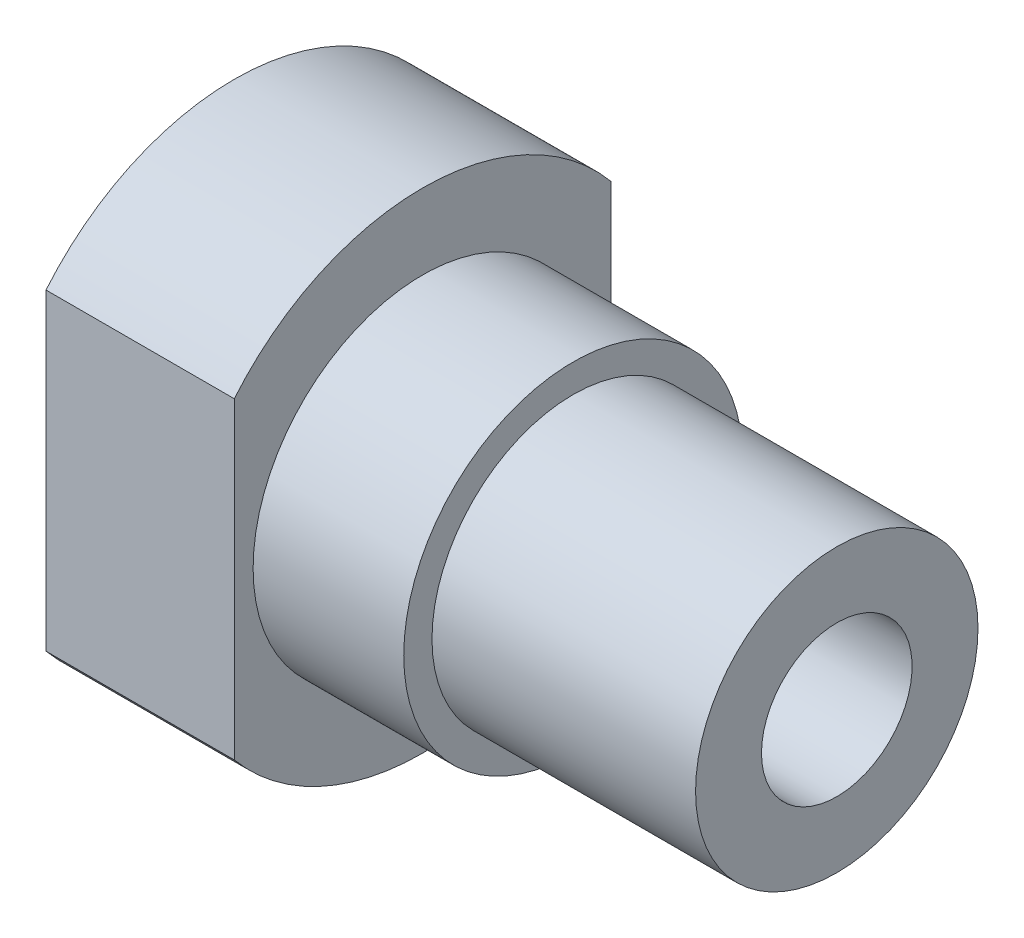
ISO-10303-21;
HEADER;
FILE_DESCRIPTION(('STEP AP214'),'2;1');
FILE_NAME('part.step','',(''),(''),'','','');
FILE_SCHEMA(('AUTOMOTIVE_DESIGN { 1 0 10303 214 1 1 1 1 }'));
ENDSEC;
DATA;
#1=APPLICATION_CONTEXT('core data for automotive mechanical design processes');
#2=APPLICATION_PROTOCOL_DEFINITION('international standard','automotive_design',2000,#1);
#3=PRODUCT_CONTEXT('',#1,'mechanical');
#4=PRODUCT('Part','Part','',(#3));
#5=PRODUCT_RELATED_PRODUCT_CATEGORY('part','',(#4));
#6=PRODUCT_DEFINITION_FORMATION('','',#4);
#7=PRODUCT_DEFINITION_CONTEXT('part definition',#1,'design');
#8=PRODUCT_DEFINITION('design','',#6,#7);
#9=PRODUCT_DEFINITION_SHAPE('','',#8);
#10=(LENGTH_UNIT() NAMED_UNIT(*) SI_UNIT(.MILLI.,.METRE.));
#11=(NAMED_UNIT(*) PLANE_ANGLE_UNIT() SI_UNIT($,.RADIAN.));
#12=(NAMED_UNIT(*) SI_UNIT($,.STERADIAN.) SOLID_ANGLE_UNIT());
#13=UNCERTAINTY_MEASURE_WITH_UNIT(LENGTH_MEASURE(1.E-05),#10,'distance_accuracy_value','');
#14=(GEOMETRIC_REPRESENTATION_CONTEXT(3) GLOBAL_UNCERTAINTY_ASSIGNED_CONTEXT((#13)) GLOBAL_UNIT_ASSIGNED_CONTEXT((#10,
#11,#12)) REPRESENTATION_CONTEXT('',''));
#15=CARTESIAN_POINT('',(0.,0.,0.));
#16=DIRECTION('',(0.,0.,1.));
#17=DIRECTION('',(1.,0.,0.));
#18=AXIS2_PLACEMENT_3D('',#15,#16,#17);
#19=CARTESIAN_POINT('',(0.,6.5,0.));
#20=DIRECTION('',(1.,0.,0.));
#21=DIRECTION('',(0.,0.,-1.));
#22=AXIS2_PLACEMENT_3D('',#19,#20,#21);
#23=PLANE('',#22);
#24=CARTESIAN_POINT('',(0.,0.,0.));
#25=DIRECTION('',(-1.,0.,0.));
#26=DIRECTION('',(0.,0.,1.));
#27=AXIS2_PLACEMENT_3D('',#24,#25,#26);
#28=CIRCLE('',#27,4.);
#29=CARTESIAN_POINT('',(0.,0.,4.));
#30=VERTEX_POINT('',#29);
#31=EDGE_CURVE('E11',#30,#30,#28,.T.);
#32=ORIENTED_EDGE('',*,*,#31,.F.);
#33=EDGE_LOOP('',(#32));
#34=FACE_BOUND('',#33,.T.);
#35=DIRECTION('',(0.,1.,0.));
#36=VECTOR('',#35,1.);
#37=CARTESIAN_POINT('',(0.,0.,-5.));
#38=LINE('',#37,#36);
#39=CARTESIAN_POINT('',(0.,-4.15331193145904,-5.));
#40=VERTEX_POINT('',#39);
#41=CARTESIAN_POINT('',(0.,4.15331193145904,-5.));
#42=VERTEX_POINT('',#41);
#43=EDGE_CURVE('E48',#40,#42,#38,.T.);
#44=ORIENTED_EDGE('',*,*,#43,.F.);
#45=CARTESIAN_POINT('',(0.,0.,0.));
#46=DIRECTION('',(-1.,0.,0.));
#47=DIRECTION('',(0.,0.,1.));
#48=AXIS2_PLACEMENT_3D('',#45,#46,#47);
#49=CIRCLE('',#48,6.5);
#50=CARTESIAN_POINT('',(0.,-4.15331193145904,5.));
#51=VERTEX_POINT('',#50);
#52=EDGE_CURVE('E85',#40,#51,#49,.T.);
#53=ORIENTED_EDGE('',*,*,#52,.T.);
#54=DIRECTION('',(0.,1.,0.));
#55=VECTOR('',#54,1.);
#56=CARTESIAN_POINT('',(0.,0.,5.));
#57=LINE('',#56,#55);
#58=CARTESIAN_POINT('',(0.,4.15331193145904,5.));
#59=VERTEX_POINT('',#58);
#60=EDGE_CURVE('E276',#51,#59,#57,.T.);
#61=ORIENTED_EDGE('',*,*,#60,.T.);
#62=EDGE_CURVE('E88',#59,#42,#49,.T.);
#63=ORIENTED_EDGE('',*,*,#62,.T.);
#64=EDGE_LOOP('',(#44,#53,#61,#63));
#65=FACE_BOUND('',#64,.T.);
#66=ADVANCED_FACE('F34',(#34,#65),#23,.F.);
#67=CARTESIAN_POINT('',(5.,4.5,0.));
#68=DIRECTION('',(-1.,0.,0.));
#69=DIRECTION('',(0.,0.,1.));
#70=AXIS2_PLACEMENT_3D('',#67,#68,#69);
#71=PLANE('',#70);
#72=CARTESIAN_POINT('',(5.,0.,0.));
#73=DIRECTION('',(-1.,0.,0.));
#74=DIRECTION('',(0.,0.,1.));
#75=AXIS2_PLACEMENT_3D('',#72,#73,#74);
#76=CIRCLE('',#75,4.5);
#77=CARTESIAN_POINT('',(5.,0.,4.5));
#78=VERTEX_POINT('',#77);
#79=EDGE_CURVE('E102',#78,#78,#76,.T.);
#80=ORIENTED_EDGE('',*,*,#79,.T.);
#81=EDGE_LOOP('',(#80));
#82=FACE_BOUND('',#81,.T.);
#83=DIRECTION('',(0.,1.,0.));
#84=VECTOR('',#83,1.);
#85=CARTESIAN_POINT('',(5.,0.,-5.));
#86=LINE('',#85,#84);
#87=CARTESIAN_POINT('',(5.,-4.15331193145904,-5.));
#88=VERTEX_POINT('',#87);
#89=CARTESIAN_POINT('',(5.,4.15331193145904,-5.));
#90=VERTEX_POINT('',#89);
#91=EDGE_CURVE('E76',#88,#90,#86,.T.);
#92=ORIENTED_EDGE('',*,*,#91,.T.);
#93=CARTESIAN_POINT('',(5.,0.,0.));
#94=DIRECTION('',(-1.,0.,0.));
#95=DIRECTION('',(0.,0.,1.));
#96=AXIS2_PLACEMENT_3D('',#93,#94,#95);
#97=CIRCLE('',#96,6.5);
#98=CARTESIAN_POINT('',(5.,4.15331193145904,5.));
#99=VERTEX_POINT('',#98);
#100=EDGE_CURVE('E99',#99,#90,#97,.T.);
#101=ORIENTED_EDGE('',*,*,#100,.F.);
#102=DIRECTION('',(0.,1.,0.));
#103=VECTOR('',#102,1.);
#104=CARTESIAN_POINT('',(5.,0.,5.));
#105=LINE('',#104,#103);
#106=CARTESIAN_POINT('',(5.,-4.15331193145904,5.));
#107=VERTEX_POINT('',#106);
#108=EDGE_CURVE('E56',#107,#99,#105,.T.);
#109=ORIENTED_EDGE('',*,*,#108,.F.);
#110=EDGE_CURVE('E95',#88,#107,#97,.T.);
#111=ORIENTED_EDGE('',*,*,#110,.F.);
#112=EDGE_LOOP('',(#92,#101,#109,#111));
#113=FACE_BOUND('',#112,.T.);
#114=ADVANCED_FACE('F137',(#82,#113),#71,.F.);
#115=CARTESIAN_POINT('',(0.,0.,0.));
#116=DIRECTION('',(-1.,0.,0.));
#117=DIRECTION('',(0.,0.,1.));
#118=AXIS2_PLACEMENT_3D('',#115,#116,#117);
#119=CYLINDRICAL_SURFACE('',#118,6.5);
#120=DIRECTION('',(1.,0.,0.));
#121=VECTOR('',#120,1.);
#122=CARTESIAN_POINT('',(0.,-4.15331193145904,-5.));
#123=LINE('',#122,#121);
#124=EDGE_CURVE('E73',#40,#88,#123,.T.);
#125=ORIENTED_EDGE('',*,*,#124,.T.);
#126=ORIENTED_EDGE('',*,*,#110,.T.);
#127=DIRECTION('',(1.,0.,0.));
#128=VECTOR('',#127,1.);
#129=CARTESIAN_POINT('',(0.,-4.15331193145904,5.));
#130=LINE('',#129,#128);
#131=EDGE_CURVE('E92',#51,#107,#130,.T.);
#132=ORIENTED_EDGE('',*,*,#131,.F.);
#133=ORIENTED_EDGE('',*,*,#52,.F.);
#134=EDGE_LOOP('',(#125,#126,#132,#133));
#135=FACE_BOUND('',#134,.T.);
#136=ADVANCED_FACE('F91',(#135),#119,.T.);
#137=DIRECTION('',(1.,0.,0.));
#138=VECTOR('',#137,1.);
#139=CARTESIAN_POINT('',(0.,4.15331193145904,-5.));
#140=LINE('',#139,#138);
#141=EDGE_CURVE('E80',#42,#90,#140,.T.);
#142=ORIENTED_EDGE('',*,*,#141,.F.);
#143=ORIENTED_EDGE('',*,*,#62,.F.);
#144=DIRECTION('',(1.,0.,0.));
#145=VECTOR('',#144,1.);
#146=CARTESIAN_POINT('',(0.,4.15331193145904,5.));
#147=LINE('',#146,#145);
#148=EDGE_CURVE('E93',#59,#99,#147,.T.);
#149=ORIENTED_EDGE('',*,*,#148,.T.);
#150=ORIENTED_EDGE('',*,*,#100,.T.);
#151=EDGE_LOOP('',(#142,#143,#149,#150));
#152=FACE_BOUND('',#151,.T.);
#153=ADVANCED_FACE('F133',(#152),#119,.T.);
#154=CARTESIAN_POINT('',(0.,0.,0.));
#155=DIRECTION('',(-1.,0.,0.));
#156=DIRECTION('',(0.,0.,1.));
#157=AXIS2_PLACEMENT_3D('',#154,#155,#156);
#158=CYLINDRICAL_SURFACE('',#157,4.);
#159=CARTESIAN_POINT('',(2.,0.,0.));
#160=DIRECTION('',(-1.,0.,0.));
#161=DIRECTION('',(0.,0.,1.));
#162=AXIS2_PLACEMENT_3D('',#159,#160,#161);
#163=CIRCLE('',#162,4.);
#164=CARTESIAN_POINT('',(2.,0.,4.));
#165=VERTEX_POINT('',#164);
#166=EDGE_CURVE('E41',#165,#165,#163,.T.);
#167=ORIENTED_EDGE('',*,*,#166,.F.);
#168=EDGE_LOOP('',(#167));
#169=FACE_BOUND('',#168,.T.);
#170=ORIENTED_EDGE('',*,*,#31,.T.);
#171=EDGE_LOOP('',(#170));
#172=FACE_BOUND('',#171,.T.);
#173=ADVANCED_FACE('F130',(#169,#172),#158,.F.);
#174=CARTESIAN_POINT('',(2.,4.,0.));
#175=DIRECTION('',(1.,0.,0.));
#176=DIRECTION('',(0.,0.,-1.));
#177=AXIS2_PLACEMENT_3D('',#174,#175,#176);
#178=PLANE('',#177);
#179=CARTESIAN_POINT('',(2.,0.,0.));
#180=DIRECTION('',(-1.,0.,0.));
#181=DIRECTION('',(0.,0.,1.));
#182=AXIS2_PLACEMENT_3D('',#179,#180,#181);
#183=CIRCLE('',#182,2.5);
#184=CARTESIAN_POINT('',(2.,0.,2.5));
#185=VERTEX_POINT('',#184);
#186=EDGE_CURVE('E123',#185,#185,#183,.T.);
#187=ORIENTED_EDGE('',*,*,#186,.F.);
#188=EDGE_LOOP('',(#187));
#189=FACE_BOUND('',#188,.T.);
#190=ORIENTED_EDGE('',*,*,#166,.T.);
#191=EDGE_LOOP('',(#190));
#192=FACE_BOUND('',#191,.T.);
#193=ADVANCED_FACE('F128',(#189,#192),#178,.F.);
#194=CARTESIAN_POINT('',(0.,0.,0.));
#195=DIRECTION('',(-1.,0.,0.));
#196=DIRECTION('',(0.,0.,1.));
#197=AXIS2_PLACEMENT_3D('',#194,#195,#196);
#198=CYLINDRICAL_SURFACE('',#197,2.5);
#199=CARTESIAN_POINT('',(6.,0.,0.));
#200=DIRECTION('',(-1.,0.,0.));
#201=DIRECTION('',(0.,0.,1.));
#202=AXIS2_PLACEMENT_3D('',#199,#200,#201);
#203=CIRCLE('',#202,2.5);
#204=CARTESIAN_POINT('',(6.,0.,2.5));
#205=VERTEX_POINT('',#204);
#206=EDGE_CURVE('E120',#205,#205,#203,.T.);
#207=ORIENTED_EDGE('',*,*,#206,.F.);
#208=EDGE_LOOP('',(#207));
#209=FACE_BOUND('',#208,.T.);
#210=ORIENTED_EDGE('',*,*,#186,.T.);
#211=EDGE_LOOP('',(#210));
#212=FACE_BOUND('',#211,.T.);
#213=ADVANCED_FACE('F174',(#209,#212),#198,.F.);
#214=CARTESIAN_POINT('',(6.,2.5,0.));
#215=DIRECTION('',(1.,0.,0.));
#216=DIRECTION('',(0.,0.,-1.));
#217=AXIS2_PLACEMENT_3D('',#214,#215,#216);
#218=PLANE('',#217);
#219=CARTESIAN_POINT('',(6.,0.,0.));
#220=DIRECTION('',(-1.,0.,0.));
#221=DIRECTION('',(0.,0.,1.));
#222=AXIS2_PLACEMENT_3D('',#219,#220,#221);
#223=CIRCLE('',#222,2.);
#224=CARTESIAN_POINT('',(6.,0.,2.));
#225=VERTEX_POINT('',#224);
#226=EDGE_CURVE('E117',#225,#225,#223,.T.);
#227=ORIENTED_EDGE('',*,*,#226,.F.);
#228=EDGE_LOOP('',(#227));
#229=FACE_BOUND('',#228,.T.);
#230=ORIENTED_EDGE('',*,*,#206,.T.);
#231=EDGE_LOOP('',(#230));
#232=FACE_BOUND('',#231,.T.);
#233=ADVANCED_FACE('F170',(#229,#232),#218,.F.);
#234=CARTESIAN_POINT('',(0.,0.,0.));
#235=DIRECTION('',(-1.,0.,0.));
#236=DIRECTION('',(0.,0.,1.));
#237=AXIS2_PLACEMENT_3D('',#234,#235,#236);
#238=CYLINDRICAL_SURFACE('',#237,2.);
#239=CARTESIAN_POINT('',(16.,0.,0.));
#240=DIRECTION('',(-1.,0.,0.));
#241=DIRECTION('',(0.,0.,1.));
#242=AXIS2_PLACEMENT_3D('',#239,#240,#241);
#243=CIRCLE('',#242,2.);
#244=CARTESIAN_POINT('',(16.,0.,2.));
#245=VERTEX_POINT('',#244);
#246=EDGE_CURVE('E114',#245,#245,#243,.T.);
#247=ORIENTED_EDGE('',*,*,#246,.F.);
#248=EDGE_LOOP('',(#247));
#249=FACE_BOUND('',#248,.T.);
#250=ORIENTED_EDGE('',*,*,#226,.T.);
#251=EDGE_LOOP('',(#250));
#252=FACE_BOUND('',#251,.T.);
#253=ADVANCED_FACE('F166',(#249,#252),#238,.F.);
#254=CARTESIAN_POINT('',(16.,2.,0.));
#255=DIRECTION('',(-1.,0.,0.));
#256=DIRECTION('',(0.,0.,1.));
#257=AXIS2_PLACEMENT_3D('',#254,#255,#256);
#258=PLANE('',#257);
#259=CARTESIAN_POINT('',(16.,0.,0.));
#260=DIRECTION('',(-1.,0.,0.));
#261=DIRECTION('',(0.,0.,1.));
#262=AXIS2_PLACEMENT_3D('',#259,#260,#261);
#263=CIRCLE('',#262,3.75);
#264=CARTESIAN_POINT('',(16.,0.,3.75));
#265=VERTEX_POINT('',#264);
#266=EDGE_CURVE('E111',#265,#265,#263,.T.);
#267=ORIENTED_EDGE('',*,*,#266,.F.);
#268=EDGE_LOOP('',(#267));
#269=FACE_BOUND('',#268,.T.);
#270=ORIENTED_EDGE('',*,*,#246,.T.);
#271=EDGE_LOOP('',(#270));
#272=FACE_BOUND('',#271,.T.);
#273=ADVANCED_FACE('F162',(#269,#272),#258,.F.);
#274=CARTESIAN_POINT('',(0.,0.,0.));
#275=DIRECTION('',(-1.,0.,0.));
#276=DIRECTION('',(0.,0.,1.));
#277=AXIS2_PLACEMENT_3D('',#274,#275,#276);
#278=CYLINDRICAL_SURFACE('',#277,3.75);
#279=CARTESIAN_POINT('',(9.,0.,0.));
#280=DIRECTION('',(-1.,0.,0.));
#281=DIRECTION('',(0.,0.,1.));
#282=AXIS2_PLACEMENT_3D('',#279,#280,#281);
#283=CIRCLE('',#282,3.75);
#284=CARTESIAN_POINT('',(9.,0.,3.75));
#285=VERTEX_POINT('',#284);
#286=EDGE_CURVE('E108',#285,#285,#283,.T.);
#287=ORIENTED_EDGE('',*,*,#286,.F.);
#288=EDGE_LOOP('',(#287));
#289=FACE_BOUND('',#288,.T.);
#290=ORIENTED_EDGE('',*,*,#266,.T.);
#291=EDGE_LOOP('',(#290));
#292=FACE_BOUND('',#291,.T.);
#293=ADVANCED_FACE('F158',(#289,#292),#278,.T.);
#294=CARTESIAN_POINT('',(9.,3.75,0.));
#295=DIRECTION('',(-1.,0.,0.));
#296=DIRECTION('',(0.,0.,1.));
#297=AXIS2_PLACEMENT_3D('',#294,#295,#296);
#298=PLANE('',#297);
#299=CARTESIAN_POINT('',(9.,0.,0.));
#300=DIRECTION('',(-1.,0.,0.));
#301=DIRECTION('',(0.,0.,1.));
#302=AXIS2_PLACEMENT_3D('',#299,#300,#301);
#303=CIRCLE('',#302,4.5);
#304=CARTESIAN_POINT('',(9.,0.,4.5));
#305=VERTEX_POINT('',#304);
#306=EDGE_CURVE('E105',#305,#305,#303,.T.);
#307=ORIENTED_EDGE('',*,*,#306,.F.);
#308=EDGE_LOOP('',(#307));
#309=FACE_BOUND('',#308,.T.);
#310=ORIENTED_EDGE('',*,*,#286,.T.);
#311=EDGE_LOOP('',(#310));
#312=FACE_BOUND('',#311,.T.);
#313=ADVANCED_FACE('F154',(#309,#312),#298,.F.);
#314=CARTESIAN_POINT('',(0.,0.,0.));
#315=DIRECTION('',(-1.,0.,0.));
#316=DIRECTION('',(0.,0.,1.));
#317=AXIS2_PLACEMENT_3D('',#314,#315,#316);
#318=CYLINDRICAL_SURFACE('',#317,4.5);
#319=ORIENTED_EDGE('',*,*,#79,.F.);
#320=EDGE_LOOP('',(#319));
#321=FACE_BOUND('',#320,.T.);
#322=ORIENTED_EDGE('',*,*,#306,.T.);
#323=EDGE_LOOP('',(#322));
#324=FACE_BOUND('',#323,.T.);
#325=ADVANCED_FACE('F150',(#321,#324),#318,.T.);
#326=CARTESIAN_POINT('',(0.,0.,5.));
#327=DIRECTION('',(0.,0.,-1.));
#328=DIRECTION('',(-1.,0.,0.));
#329=AXIS2_PLACEMENT_3D('',#326,#327,#328);
#330=PLANE('',#329);
#331=ORIENTED_EDGE('',*,*,#108,.T.);
#332=ORIENTED_EDGE('',*,*,#148,.F.);
#333=ORIENTED_EDGE('',*,*,#60,.F.);
#334=ORIENTED_EDGE('',*,*,#131,.T.);
#335=EDGE_LOOP('',(#331,#332,#333,#334));
#336=FACE_BOUND('',#335,.T.);
#337=ADVANCED_FACE('F153',(#336),#330,.F.);
#338=CARTESIAN_POINT('',(0.,0.,-5.));
#339=DIRECTION('',(0.,0.,-1.));
#340=DIRECTION('',(-1.,0.,0.));
#341=AXIS2_PLACEMENT_3D('',#338,#339,#340);
#342=PLANE('',#341);
#343=ORIENTED_EDGE('',*,*,#91,.F.);
#344=ORIENTED_EDGE('',*,*,#124,.F.);
#345=ORIENTED_EDGE('',*,*,#43,.T.);
#346=ORIENTED_EDGE('',*,*,#141,.T.);
#347=EDGE_LOOP('',(#343,#344,#345,#346));
#348=FACE_BOUND('',#347,.T.);
#349=ADVANCED_FACE('F74',(#348),#342,.T.);
#350=CLOSED_SHELL('',(#66,#114,#136,#153,#173,#193,#213,#233,#253,#273,#293,#313,#325,#337,#349));
#351=MANIFOLD_SOLID_BREP('B2',#350);
#352=ADVANCED_BREP_SHAPE_REPRESENTATION('',(#18,#351),#14);
#353=SHAPE_DEFINITION_REPRESENTATION(#9,#352);
ENDSEC;
END-ISO-10303-21;
